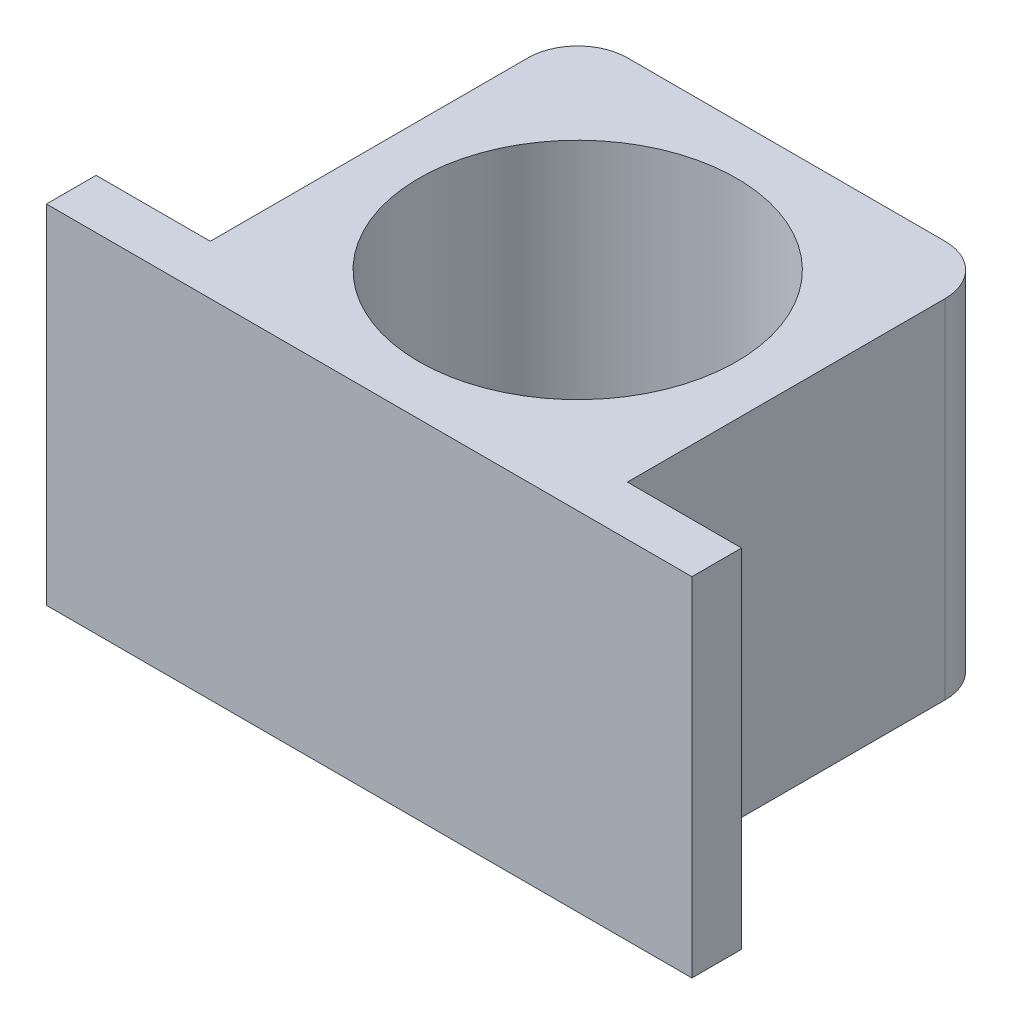
ISO-10303-21;
HEADER;
FILE_DESCRIPTION(('STEP AP214'),'2;1');
FILE_NAME('part.step','',(''),(''),'','','');
FILE_SCHEMA(('AUTOMOTIVE_DESIGN { 1 0 10303 214 1 1 1 1 }'));
ENDSEC;
DATA;
#1=APPLICATION_CONTEXT('core data for automotive mechanical design processes');
#2=APPLICATION_PROTOCOL_DEFINITION('international standard','automotive_design',2000,#1);
#3=PRODUCT_CONTEXT('',#1,'mechanical');
#4=PRODUCT('Part','Part','',(#3));
#5=PRODUCT_RELATED_PRODUCT_CATEGORY('part','',(#4));
#6=PRODUCT_DEFINITION_FORMATION('','',#4);
#7=PRODUCT_DEFINITION_CONTEXT('part definition',#1,'design');
#8=PRODUCT_DEFINITION('design','',#6,#7);
#9=PRODUCT_DEFINITION_SHAPE('','',#8);
#10=(LENGTH_UNIT() NAMED_UNIT(*) SI_UNIT(.MILLI.,.METRE.));
#11=(NAMED_UNIT(*) PLANE_ANGLE_UNIT() SI_UNIT($,.RADIAN.));
#12=(NAMED_UNIT(*) SI_UNIT($,.STERADIAN.) SOLID_ANGLE_UNIT());
#13=UNCERTAINTY_MEASURE_WITH_UNIT(LENGTH_MEASURE(1.E-05),#10,'distance_accuracy_value','');
#14=(GEOMETRIC_REPRESENTATION_CONTEXT(3) GLOBAL_UNCERTAINTY_ASSIGNED_CONTEXT((#13)) GLOBAL_UNIT_ASSIGNED_CONTEXT((#10,
#11,#12)) REPRESENTATION_CONTEXT('',''));
#15=CARTESIAN_POINT('',(0.,0.,0.));
#16=DIRECTION('',(0.,0.,1.));
#17=DIRECTION('',(1.,0.,0.));
#18=AXIS2_PLACEMENT_3D('',#15,#16,#17);
#19=CARTESIAN_POINT('',(-27.5,35.,-21.));
#20=DIRECTION('',(0.,0.,1.));
#21=DIRECTION('',(1.,0.,0.));
#22=AXIS2_PLACEMENT_3D('',#19,#20,#21);
#23=PLANE('',#22);
#24=DIRECTION('',(-1.,0.,0.));
#25=VECTOR('',#24,1.);
#26=CARTESIAN_POINT('',(-27.5,0.,-21.));
#27=LINE('',#26,#25);
#28=CARTESIAN_POINT('',(16.,0.,-21.));
#29=VERTEX_POINT('',#28);
#30=CARTESIAN_POINT('',(-16.,0.,-21.));
#31=VERTEX_POINT('',#30);
#32=EDGE_CURVE('E199',#29,#31,#27,.T.);
#33=ORIENTED_EDGE('',*,*,#32,.T.);
#34=DIRECTION('',(0.,1.,0.));
#35=VECTOR('',#34,1.);
#36=CARTESIAN_POINT('',(-16.,35.,-21.));
#37=LINE('',#36,#35);
#38=CARTESIAN_POINT('',(-16.,35.,-21.));
#39=VERTEX_POINT('',#38);
#40=EDGE_CURVE('E218',#31,#39,#37,.T.);
#41=ORIENTED_EDGE('',*,*,#40,.T.);
#42=DIRECTION('',(-1.,0.,0.));
#43=VECTOR('',#42,1.);
#44=CARTESIAN_POINT('',(-27.5,35.,-21.));
#45=LINE('',#44,#43);
#46=CARTESIAN_POINT('',(16.,35.,-21.));
#47=VERTEX_POINT('',#46);
#48=EDGE_CURVE('E203',#47,#39,#45,.T.);
#49=ORIENTED_EDGE('',*,*,#48,.F.);
#50=DIRECTION('',(0.,1.,0.));
#51=VECTOR('',#50,1.);
#52=CARTESIAN_POINT('',(16.,35.,-21.));
#53=LINE('',#52,#51);
#54=EDGE_CURVE('E210',#47,#29,#53,.F.);
#55=ORIENTED_EDGE('',*,*,#54,.T.);
#56=EDGE_LOOP('',(#33,#41,#49,#55));
#57=FACE_BOUND('',#56,.T.);
#58=ADVANCED_FACE('F39',(#57),#23,.F.);
#59=CARTESIAN_POINT('',(-27.5,35.,21.));
#60=DIRECTION('',(0.,0.,-1.));
#61=DIRECTION('',(-1.,0.,0.));
#62=AXIS2_PLACEMENT_3D('',#59,#60,#61);
#63=PLANE('',#62);
#64=DIRECTION('',(1.,0.,0.));
#65=VECTOR('',#64,1.);
#66=CARTESIAN_POINT('',(-27.5,0.,21.));
#67=LINE('',#66,#65);
#68=CARTESIAN_POINT('',(-32.5,0.,21.));
#69=VERTEX_POINT('',#68);
#70=CARTESIAN_POINT('',(32.5,0.,21.));
#71=VERTEX_POINT('',#70);
#72=EDGE_CURVE('E135',#69,#71,#67,.T.);
#73=ORIENTED_EDGE('',*,*,#72,.T.);
#74=DIRECTION('',(0.,-1.,0.));
#75=VECTOR('',#74,1.);
#76=CARTESIAN_POINT('',(32.5,35.,21.));
#77=LINE('',#76,#75);
#78=CARTESIAN_POINT('',(32.5,35.,21.));
#79=VERTEX_POINT('',#78);
#80=EDGE_CURVE('E153',#79,#71,#77,.T.);
#81=ORIENTED_EDGE('',*,*,#80,.F.);
#82=DIRECTION('',(1.,0.,0.));
#83=VECTOR('',#82,1.);
#84=CARTESIAN_POINT('',(-27.5,35.,21.));
#85=LINE('',#84,#83);
#86=CARTESIAN_POINT('',(-32.5,35.,21.));
#87=VERTEX_POINT('',#86);
#88=EDGE_CURVE('E207',#87,#79,#85,.T.);
#89=ORIENTED_EDGE('',*,*,#88,.F.);
#90=DIRECTION('',(0.,1.,0.));
#91=VECTOR('',#90,1.);
#92=CARTESIAN_POINT('',(-32.5,35.,21.));
#93=LINE('',#92,#91);
#94=EDGE_CURVE('E140',#69,#87,#93,.T.);
#95=ORIENTED_EDGE('',*,*,#94,.F.);
#96=EDGE_LOOP('',(#73,#81,#89,#95));
#97=FACE_BOUND('',#96,.T.);
#98=ADVANCED_FACE('F251',(#97),#63,.F.);
#99=CARTESIAN_POINT('',(0.,35.,0.));
#100=DIRECTION('',(0.,1.,0.));
#101=DIRECTION('',(0.,0.,1.));
#102=AXIS2_PLACEMENT_3D('',#99,#100,#101);
#103=PLANE('',#102);
#104=ORIENTED_EDGE('',*,*,#48,.T.);
#105=CARTESIAN_POINT('',(-16.,35.,-16.));
#106=DIRECTION('',(0.,1.,0.));
#107=DIRECTION('',(0.,0.,1.));
#108=AXIS2_PLACEMENT_3D('',#105,#106,#107);
#109=CIRCLE('',#108,5.);
#110=CARTESIAN_POINT('',(-21.,35.,-16.));
#111=VERTEX_POINT('',#110);
#112=EDGE_CURVE('E225',#39,#111,#109,.T.);
#113=ORIENTED_EDGE('',*,*,#112,.T.);
#114=DIRECTION('',(0.,0.,-1.));
#115=VECTOR('',#114,1.);
#116=CARTESIAN_POINT('',(-21.,35.,-21.));
#117=LINE('',#116,#115);
#118=CARTESIAN_POINT('',(-21.,35.,16.));
#119=VERTEX_POINT('',#118);
#120=EDGE_CURVE('E129',#119,#111,#117,.T.);
#121=ORIENTED_EDGE('',*,*,#120,.F.);
#122=DIRECTION('',(1.,0.,0.));
#123=VECTOR('',#122,1.);
#124=CARTESIAN_POINT('',(-27.5,35.,16.));
#125=LINE('',#124,#123);
#126=CARTESIAN_POINT('',(-32.5,35.,16.));
#127=VERTEX_POINT('',#126);
#128=EDGE_CURVE('E172',#127,#119,#125,.T.);
#129=ORIENTED_EDGE('',*,*,#128,.F.);
#130=DIRECTION('',(0.,0.,-1.));
#131=VECTOR('',#130,1.);
#132=CARTESIAN_POINT('',(-32.5,35.,16.));
#133=LINE('',#132,#131);
#134=EDGE_CURVE('E145',#87,#127,#133,.T.);
#135=ORIENTED_EDGE('',*,*,#134,.F.);
#136=ORIENTED_EDGE('',*,*,#88,.T.);
#137=DIRECTION('',(0.,0.,1.));
#138=VECTOR('',#137,1.);
#139=CARTESIAN_POINT('',(32.5,35.,21.));
#140=LINE('',#139,#138);
#141=CARTESIAN_POINT('',(32.5,35.,16.));
#142=VERTEX_POINT('',#141);
#143=EDGE_CURVE('E165',#142,#79,#140,.T.);
#144=ORIENTED_EDGE('',*,*,#143,.F.);
#145=DIRECTION('',(1.,0.,0.));
#146=VECTOR('',#145,1.);
#147=CARTESIAN_POINT('',(27.5,35.,16.));
#148=LINE('',#147,#146);
#149=CARTESIAN_POINT('',(21.,35.,16.));
#150=VERTEX_POINT('',#149);
#151=EDGE_CURVE('E185',#150,#142,#148,.T.);
#152=ORIENTED_EDGE('',*,*,#151,.F.);
#153=DIRECTION('',(0.,0.,1.));
#154=VECTOR('',#153,1.);
#155=CARTESIAN_POINT('',(21.,35.,-21.));
#156=LINE('',#155,#154);
#157=CARTESIAN_POINT('',(21.,35.,-16.));
#158=VERTEX_POINT('',#157);
#159=EDGE_CURVE('E168',#158,#150,#156,.T.);
#160=ORIENTED_EDGE('',*,*,#159,.F.);
#161=CARTESIAN_POINT('',(16.,35.,-16.));
#162=DIRECTION('',(0.,1.,0.));
#163=DIRECTION('',(0.,0.,1.));
#164=AXIS2_PLACEMENT_3D('',#161,#162,#163);
#165=CIRCLE('',#164,5.);
#166=EDGE_CURVE('E222',#158,#47,#165,.T.);
#167=ORIENTED_EDGE('',*,*,#166,.T.);
#168=EDGE_LOOP('',(#104,#113,#121,#129,#135,#136,#144,#152,#160,#167));
#169=FACE_BOUND('',#168,.T.);
#170=CARTESIAN_POINT('',(0.,35.,0.));
#171=DIRECTION('',(0.,1.,0.));
#172=DIRECTION('',(0.,0.,1.));
#173=AXIS2_PLACEMENT_3D('',#170,#171,#172);
#174=CIRCLE('',#173,16.);
#175=CARTESIAN_POINT('',(0.,35.,16.));
#176=VERTEX_POINT('',#175);
#177=EDGE_CURVE('E180',#176,#176,#174,.T.);
#178=ORIENTED_EDGE('',*,*,#177,.F.);
#179=EDGE_LOOP('',(#178));
#180=FACE_BOUND('',#179,.T.);
#181=ADVANCED_FACE('F241',(#169,#180),#103,.T.);
#182=CARTESIAN_POINT('',(0.,0.,0.));
#183=DIRECTION('',(0.,1.,0.));
#184=DIRECTION('',(0.,0.,1.));
#185=AXIS2_PLACEMENT_3D('',#182,#183,#184);
#186=PLANE('',#185);
#187=CARTESIAN_POINT('',(0.,0.,0.));
#188=DIRECTION('',(0.,1.,0.));
#189=DIRECTION('',(0.,0.,1.));
#190=AXIS2_PLACEMENT_3D('',#187,#188,#189);
#191=CIRCLE('',#190,16.);
#192=CARTESIAN_POINT('',(0.,0.,16.));
#193=VERTEX_POINT('',#192);
#194=EDGE_CURVE('E195',#193,#193,#191,.T.);
#195=ORIENTED_EDGE('',*,*,#194,.T.);
#196=EDGE_LOOP('',(#195));
#197=FACE_BOUND('',#196,.T.);
#198=DIRECTION('',(0.,0.,-1.));
#199=VECTOR('',#198,1.);
#200=CARTESIAN_POINT('',(-21.,0.,-21.));
#201=LINE('',#200,#199);
#202=CARTESIAN_POINT('',(-21.,0.,16.));
#203=VERTEX_POINT('',#202);
#204=CARTESIAN_POINT('',(-21.,0.,-16.));
#205=VERTEX_POINT('',#204);
#206=EDGE_CURVE('E128',#203,#205,#201,.T.);
#207=ORIENTED_EDGE('',*,*,#206,.T.);
#208=CARTESIAN_POINT('',(-16.,0.,-16.));
#209=DIRECTION('',(0.,1.,0.));
#210=DIRECTION('',(0.,0.,1.));
#211=AXIS2_PLACEMENT_3D('',#208,#209,#210);
#212=CIRCLE('',#211,5.);
#213=EDGE_CURVE('E48',#205,#31,#212,.F.);
#214=ORIENTED_EDGE('',*,*,#213,.T.);
#215=ORIENTED_EDGE('',*,*,#32,.F.);
#216=CARTESIAN_POINT('',(16.,0.,-16.));
#217=DIRECTION('',(0.,1.,0.));
#218=DIRECTION('',(0.,0.,1.));
#219=AXIS2_PLACEMENT_3D('',#216,#217,#218);
#220=CIRCLE('',#219,5.);
#221=CARTESIAN_POINT('',(21.,0.,-16.));
#222=VERTEX_POINT('',#221);
#223=EDGE_CURVE('E55',#29,#222,#220,.F.);
#224=ORIENTED_EDGE('',*,*,#223,.T.);
#225=DIRECTION('',(0.,0.,1.));
#226=VECTOR('',#225,1.);
#227=CARTESIAN_POINT('',(21.,0.,-21.));
#228=LINE('',#227,#226);
#229=CARTESIAN_POINT('',(21.,0.,16.));
#230=VERTEX_POINT('',#229);
#231=EDGE_CURVE('E181',#222,#230,#228,.T.);
#232=ORIENTED_EDGE('',*,*,#231,.T.);
#233=DIRECTION('',(1.,0.,0.));
#234=VECTOR('',#233,1.);
#235=CARTESIAN_POINT('',(27.5,0.,16.));
#236=LINE('',#235,#234);
#237=CARTESIAN_POINT('',(32.5,0.,16.));
#238=VERTEX_POINT('',#237);
#239=EDGE_CURVE('E184',#230,#238,#236,.T.);
#240=ORIENTED_EDGE('',*,*,#239,.T.);
#241=DIRECTION('',(0.,0.,-1.));
#242=VECTOR('',#241,1.);
#243=CARTESIAN_POINT('',(32.5,0.,21.));
#244=LINE('',#243,#242);
#245=EDGE_CURVE('E157',#71,#238,#244,.T.);
#246=ORIENTED_EDGE('',*,*,#245,.F.);
#247=ORIENTED_EDGE('',*,*,#72,.F.);
#248=DIRECTION('',(0.,0.,1.));
#249=VECTOR('',#248,1.);
#250=CARTESIAN_POINT('',(-32.5,0.,16.));
#251=LINE('',#250,#249);
#252=CARTESIAN_POINT('',(-32.5,0.,16.));
#253=VERTEX_POINT('',#252);
#254=EDGE_CURVE('E132',#253,#69,#251,.T.);
#255=ORIENTED_EDGE('',*,*,#254,.F.);
#256=DIRECTION('',(1.,0.,0.));
#257=VECTOR('',#256,1.);
#258=CARTESIAN_POINT('',(-27.5,0.,16.));
#259=LINE('',#258,#257);
#260=EDGE_CURVE('E120',#253,#203,#259,.T.);
#261=ORIENTED_EDGE('',*,*,#260,.T.);
#262=EDGE_LOOP('',(#207,#214,#215,#224,#232,#240,#246,#247,#255,#261));
#263=FACE_BOUND('',#262,.T.);
#264=ADVANCED_FACE('F133',(#197,#263),#186,.F.);
#265=CARTESIAN_POINT('',(0.,0.,0.));
#266=DIRECTION('',(0.,1.,0.));
#267=DIRECTION('',(0.,0.,1.));
#268=AXIS2_PLACEMENT_3D('',#265,#266,#267);
#269=CYLINDRICAL_SURFACE('',#268,16.);
#270=ORIENTED_EDGE('',*,*,#194,.F.);
#271=EDGE_LOOP('',(#270));
#272=FACE_BOUND('',#271,.T.);
#273=ORIENTED_EDGE('',*,*,#177,.T.);
#274=EDGE_LOOP('',(#273));
#275=FACE_BOUND('',#274,.T.);
#276=ADVANCED_FACE('F276',(#272,#275),#269,.F.);
#277=CARTESIAN_POINT('',(27.5,0.,16.));
#278=DIRECTION('',(0.,0.,1.));
#279=DIRECTION('',(1.,0.,0.));
#280=AXIS2_PLACEMENT_3D('',#277,#278,#279);
#281=PLANE('',#280);
#282=ORIENTED_EDGE('',*,*,#151,.T.);
#283=DIRECTION('',(0.,1.,0.));
#284=VECTOR('',#283,1.);
#285=CARTESIAN_POINT('',(32.5,35.,16.));
#286=LINE('',#285,#284);
#287=EDGE_CURVE('E161',#238,#142,#286,.T.);
#288=ORIENTED_EDGE('',*,*,#287,.F.);
#289=ORIENTED_EDGE('',*,*,#239,.F.);
#290=DIRECTION('',(0.,1.,0.));
#291=VECTOR('',#290,1.);
#292=CARTESIAN_POINT('',(21.,0.,16.));
#293=LINE('',#292,#291);
#294=EDGE_CURVE('E175',#230,#150,#293,.T.);
#295=ORIENTED_EDGE('',*,*,#294,.T.);
#296=EDGE_LOOP('',(#282,#288,#289,#295));
#297=FACE_BOUND('',#296,.T.);
#298=ADVANCED_FACE('F254',(#297),#281,.F.);
#299=CARTESIAN_POINT('',(21.,0.,-21.));
#300=DIRECTION('',(-1.,0.,0.));
#301=DIRECTION('',(0.,0.,1.));
#302=AXIS2_PLACEMENT_3D('',#299,#300,#301);
#303=PLANE('',#302);
#304=ORIENTED_EDGE('',*,*,#231,.F.);
#305=DIRECTION('',(0.,1.,0.));
#306=VECTOR('',#305,1.);
#307=CARTESIAN_POINT('',(21.,0.,-16.));
#308=LINE('',#307,#306);
#309=EDGE_CURVE('E11',#222,#158,#308,.T.);
#310=ORIENTED_EDGE('',*,*,#309,.T.);
#311=ORIENTED_EDGE('',*,*,#159,.T.);
#312=ORIENTED_EDGE('',*,*,#294,.F.);
#313=EDGE_LOOP('',(#304,#310,#311,#312));
#314=FACE_BOUND('',#313,.T.);
#315=ADVANCED_FACE('F258',(#314),#303,.F.);
#316=CARTESIAN_POINT('',(-21.,0.,-21.));
#317=DIRECTION('',(1.,0.,0.));
#318=DIRECTION('',(0.,0.,-1.));
#319=AXIS2_PLACEMENT_3D('',#316,#317,#318);
#320=PLANE('',#319);
#321=ORIENTED_EDGE('',*,*,#120,.T.);
#322=DIRECTION('',(0.,1.,0.));
#323=VECTOR('',#322,1.);
#324=CARTESIAN_POINT('',(-21.,0.,-16.));
#325=LINE('',#324,#323);
#326=EDGE_CURVE('E63',#111,#205,#325,.F.);
#327=ORIENTED_EDGE('',*,*,#326,.T.);
#328=ORIENTED_EDGE('',*,*,#206,.F.);
#329=DIRECTION('',(0.,1.,0.));
#330=VECTOR('',#329,1.);
#331=CARTESIAN_POINT('',(-21.,0.,16.));
#332=LINE('',#331,#330);
#333=EDGE_CURVE('E126',#203,#119,#332,.T.);
#334=ORIENTED_EDGE('',*,*,#333,.T.);
#335=EDGE_LOOP('',(#321,#327,#328,#334));
#336=FACE_BOUND('',#335,.T.);
#337=ADVANCED_FACE('F243',(#336),#320,.F.);
#338=CARTESIAN_POINT('',(-27.5,0.,16.));
#339=DIRECTION('',(0.,0.,1.));
#340=DIRECTION('',(1.,0.,0.));
#341=AXIS2_PLACEMENT_3D('',#338,#339,#340);
#342=PLANE('',#341);
#343=ORIENTED_EDGE('',*,*,#128,.T.);
#344=ORIENTED_EDGE('',*,*,#333,.F.);
#345=ORIENTED_EDGE('',*,*,#260,.F.);
#346=DIRECTION('',(0.,-1.,0.));
#347=VECTOR('',#346,1.);
#348=CARTESIAN_POINT('',(-32.5,35.,16.));
#349=LINE('',#348,#347);
#350=EDGE_CURVE('E125',#127,#253,#349,.T.);
#351=ORIENTED_EDGE('',*,*,#350,.F.);
#352=EDGE_LOOP('',(#343,#344,#345,#351));
#353=FACE_BOUND('',#352,.T.);
#354=ADVANCED_FACE('F123',(#353),#342,.F.);
#355=CARTESIAN_POINT('',(-16.,35.,-16.));
#356=DIRECTION('',(0.,1.,0.));
#357=DIRECTION('',(0.,0.,1.));
#358=AXIS2_PLACEMENT_3D('',#355,#356,#357);
#359=CYLINDRICAL_SURFACE('',#358,5.);
#360=ORIENTED_EDGE('',*,*,#213,.F.);
#361=ORIENTED_EDGE('',*,*,#326,.F.);
#362=ORIENTED_EDGE('',*,*,#112,.F.);
#363=ORIENTED_EDGE('',*,*,#40,.F.);
#364=EDGE_LOOP('',(#360,#361,#362,#363));
#365=FACE_BOUND('',#364,.T.);
#366=ADVANCED_FACE('F238',(#365),#359,.T.);
#367=CARTESIAN_POINT('',(16.,0.,-16.));
#368=DIRECTION('',(0.,1.,0.));
#369=DIRECTION('',(0.,0.,1.));
#370=AXIS2_PLACEMENT_3D('',#367,#368,#369);
#371=CYLINDRICAL_SURFACE('',#370,5.);
#372=ORIENTED_EDGE('',*,*,#223,.F.);
#373=ORIENTED_EDGE('',*,*,#54,.F.);
#374=ORIENTED_EDGE('',*,*,#166,.F.);
#375=ORIENTED_EDGE('',*,*,#309,.F.);
#376=EDGE_LOOP('',(#372,#373,#374,#375));
#377=FACE_BOUND('',#376,.T.);
#378=ADVANCED_FACE('F41',(#377),#371,.T.);
#379=CARTESIAN_POINT('',(32.5,0.,0.));
#380=DIRECTION('',(1.,0.,0.));
#381=DIRECTION('',(0.,0.,-1.));
#382=AXIS2_PLACEMENT_3D('',#379,#380,#381);
#383=PLANE('',#382);
#384=ORIENTED_EDGE('',*,*,#80,.T.);
#385=ORIENTED_EDGE('',*,*,#245,.T.);
#386=ORIENTED_EDGE('',*,*,#287,.T.);
#387=ORIENTED_EDGE('',*,*,#143,.T.);
#388=EDGE_LOOP('',(#384,#385,#386,#387));
#389=FACE_BOUND('',#388,.T.);
#390=ADVANCED_FACE('F249',(#389),#383,.T.);
#391=CARTESIAN_POINT('',(-32.5,0.,0.));
#392=DIRECTION('',(-1.,0.,0.));
#393=DIRECTION('',(0.,0.,1.));
#394=AXIS2_PLACEMENT_3D('',#391,#392,#393);
#395=PLANE('',#394);
#396=ORIENTED_EDGE('',*,*,#350,.T.);
#397=ORIENTED_EDGE('',*,*,#254,.T.);
#398=ORIENTED_EDGE('',*,*,#94,.T.);
#399=ORIENTED_EDGE('',*,*,#134,.T.);
#400=EDGE_LOOP('',(#396,#397,#398,#399));
#401=FACE_BOUND('',#400,.T.);
#402=ADVANCED_FACE('F143',(#401),#395,.T.);
#403=CLOSED_SHELL('',(#58,#98,#181,#264,#276,#298,#315,#337,#354,#366,#378,#390,#402));
#404=MANIFOLD_SOLID_BREP('B2',#403);
#405=ADVANCED_BREP_SHAPE_REPRESENTATION('',(#18,#404),#14);
#406=SHAPE_DEFINITION_REPRESENTATION(#9,#405);
ENDSEC;
END-ISO-10303-21;
